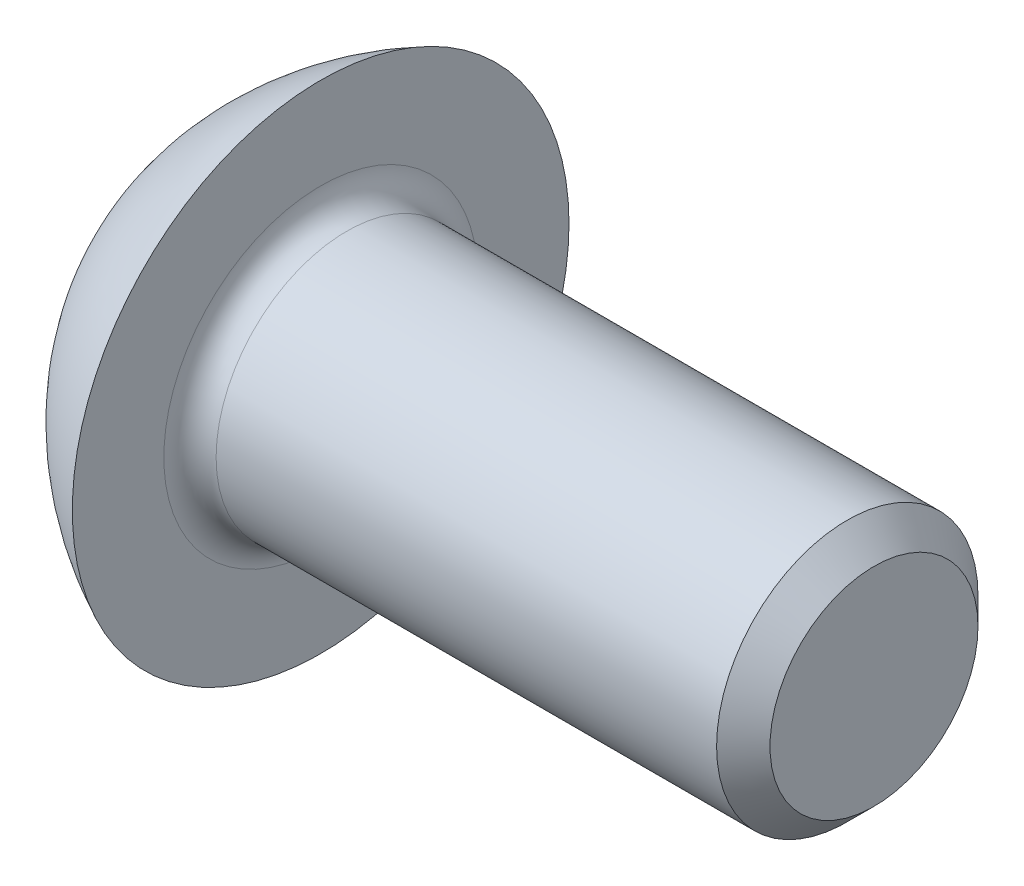
ISO-10303-21;
HEADER;
FILE_DESCRIPTION(('STEP AP214'),'2;1');
FILE_NAME('part.step','',(''),(''),'','','');
FILE_SCHEMA(('AUTOMOTIVE_DESIGN { 1 0 10303 214 1 1 1 1 }'));
ENDSEC;
DATA;
#1=APPLICATION_CONTEXT('core data for automotive mechanical design processes');
#2=APPLICATION_PROTOCOL_DEFINITION('international standard','automotive_design',2000,#1);
#3=PRODUCT_CONTEXT('',#1,'mechanical');
#4=PRODUCT('Part','Part','',(#3));
#5=PRODUCT_RELATED_PRODUCT_CATEGORY('part','',(#4));
#6=PRODUCT_DEFINITION_FORMATION('','',#4);
#7=PRODUCT_DEFINITION_CONTEXT('part definition',#1,'design');
#8=PRODUCT_DEFINITION('design','',#6,#7);
#9=PRODUCT_DEFINITION_SHAPE('','',#8);
#10=(LENGTH_UNIT() NAMED_UNIT(*) SI_UNIT(.MILLI.,.METRE.));
#11=(NAMED_UNIT(*) PLANE_ANGLE_UNIT() SI_UNIT($,.RADIAN.));
#12=(NAMED_UNIT(*) SI_UNIT($,.STERADIAN.) SOLID_ANGLE_UNIT());
#13=UNCERTAINTY_MEASURE_WITH_UNIT(LENGTH_MEASURE(1.E-05),#10,'distance_accuracy_value','');
#14=(GEOMETRIC_REPRESENTATION_CONTEXT(3) GLOBAL_UNCERTAINTY_ASSIGNED_CONTEXT((#13)) GLOBAL_UNIT_ASSIGNED_CONTEXT((#10,
#11,#12)) REPRESENTATION_CONTEXT('',''));
#15=CARTESIAN_POINT('',(0.,0.,0.));
#16=DIRECTION('',(0.,0.,1.));
#17=DIRECTION('',(1.,0.,0.));
#18=AXIS2_PLACEMENT_3D('',#15,#16,#17);
#19=CARTESIAN_POINT('',(0.,0.,0.));
#20=DIRECTION('',(1.,0.,0.));
#21=DIRECTION('',(0.,0.,-1.));
#22=AXIS2_PLACEMENT_3D('',#19,#20,#21);
#23=PLANE('',#22);
#24=CARTESIAN_POINT('',(0.,0.,0.));
#25=DIRECTION('',(1.,0.,0.));
#26=DIRECTION('',(0.,0.,-1.));
#27=AXIS2_PLACEMENT_3D('',#24,#25,#26);
#28=CIRCLE('',#27,1.30000000000001);
#29=CARTESIAN_POINT('',(0.,0.,-1.30000000000001));
#30=VERTEX_POINT('',#29);
#31=EDGE_CURVE('E97',#30,#30,#28,.T.);
#32=ORIENTED_EDGE('',*,*,#31,.F.);
#33=EDGE_LOOP('',(#32));
#34=FACE_BOUND('',#33,.T.);
#35=DIRECTION('',(0.,-1.,0.));
#36=VECTOR('',#35,1.);
#37=CARTESIAN_POINT('',(0.,0.57735026918963,1.));
#38=LINE('',#37,#36);
#39=CARTESIAN_POINT('',(0.,0.57735026918963,1.));
#40=VERTEX_POINT('',#39);
#41=CARTESIAN_POINT('',(0.,-0.57735026918963,1.));
#42=VERTEX_POINT('',#41);
#43=EDGE_CURVE('E82',#40,#42,#38,.T.);
#44=ORIENTED_EDGE('',*,*,#43,.T.);
#45=DIRECTION('',(0.,-0.500000000000029,-0.866025403784422));
#46=VECTOR('',#45,1.);
#47=CARTESIAN_POINT('',(0.,-0.57735026918963,1.));
#48=LINE('',#47,#46);
#49=CARTESIAN_POINT('',(0.,-1.1547005383793,0.));
#50=VERTEX_POINT('',#49);
#51=EDGE_CURVE('E70',#42,#50,#48,.T.);
#52=ORIENTED_EDGE('',*,*,#51,.T.);
#53=DIRECTION('',(0.,0.500000000000029,-0.866025403784422));
#54=VECTOR('',#53,1.);
#55=CARTESIAN_POINT('',(0.,-1.1547005383793,0.));
#56=LINE('',#55,#54);
#57=CARTESIAN_POINT('',(0.,-0.57735026918963,-1.));
#58=VERTEX_POINT('',#57);
#59=EDGE_CURVE('E81',#50,#58,#56,.T.);
#60=ORIENTED_EDGE('',*,*,#59,.T.);
#61=DIRECTION('',(0.,1.,0.));
#62=VECTOR('',#61,1.);
#63=CARTESIAN_POINT('',(0.,-0.57735026918963,-1.));
#64=LINE('',#63,#62);
#65=CARTESIAN_POINT('',(0.,0.57735026918963,-1.));
#66=VERTEX_POINT('',#65);
#67=EDGE_CURVE('E110',#58,#66,#64,.T.);
#68=ORIENTED_EDGE('',*,*,#67,.T.);
#69=DIRECTION('',(0.,0.500000000000029,0.866025403784422));
#70=VECTOR('',#69,1.);
#71=CARTESIAN_POINT('',(0.,0.57735026918963,-1.));
#72=LINE('',#71,#70);
#73=CARTESIAN_POINT('',(0.,1.1547005383793,0.));
#74=VERTEX_POINT('',#73);
#75=EDGE_CURVE('E116',#66,#74,#72,.T.);
#76=ORIENTED_EDGE('',*,*,#75,.T.);
#77=DIRECTION('',(0.,-0.500000000000029,0.866025403784422));
#78=VECTOR('',#77,1.);
#79=CARTESIAN_POINT('',(0.,1.1547005383793,0.));
#80=LINE('',#79,#78);
#81=EDGE_CURVE('E95',#74,#40,#80,.T.);
#82=ORIENTED_EDGE('',*,*,#81,.T.);
#83=EDGE_LOOP('',(#44,#52,#60,#68,#76,#82));
#84=FACE_BOUND('',#83,.T.);
#85=ADVANCED_FACE('F17',(#34,#84),#23,.F.);
#86=CARTESIAN_POINT('',(3.23684159472575,0.,0.));
#87=DIRECTION('',(1.,0.,0.));
#88=DIRECTION('',(0.,0.,-1.));
#89=AXIS2_PLACEMENT_3D('',#86,#87,#88);
#90=DEGENERATE_TOROIDAL_SURFACE('',#89,0.492444278256446,3.70000000000014,.F.);
#91=ORIENTED_EDGE('',*,*,#31,.T.);
#92=EDGE_LOOP('',(#91));
#93=FACE_BOUND('',#92,.T.);
#94=CARTESIAN_POINT('',(1.65,0.,0.));
#95=DIRECTION('',(1.,0.,0.));
#96=DIRECTION('',(0.,0.,-1.));
#97=AXIS2_PLACEMENT_3D('',#94,#95,#96);
#98=CIRCLE('',#97,2.85);
#99=CARTESIAN_POINT('',(1.65,0.,-2.85));
#100=VERTEX_POINT('',#99);
#101=EDGE_CURVE('E125',#100,#100,#98,.T.);
#102=ORIENTED_EDGE('',*,*,#101,.F.);
#103=EDGE_LOOP('',(#102));
#104=FACE_BOUND('',#103,.T.);
#105=ADVANCED_FACE('F220',(#93,#104),#90,.F.);
#106=CARTESIAN_POINT('',(0.99,0.57735026918963,1.));
#107=DIRECTION('',(0.,0.,-1.));
#108=DIRECTION('',(-1.,0.,0.));
#109=AXIS2_PLACEMENT_3D('',#106,#107,#108);
#110=PLANE('',#109);
#111=ORIENTED_EDGE('',*,*,#43,.F.);
#112=DIRECTION('',(-1.,0.,0.));
#113=VECTOR('',#112,1.);
#114=CARTESIAN_POINT('',(0.99,0.57735026918963,1.));
#115=LINE('',#114,#113);
#116=CARTESIAN_POINT('',(0.99,0.57735026918963,1.));
#117=VERTEX_POINT('',#116);
#118=EDGE_CURVE('E131',#117,#40,#115,.T.);
#119=ORIENTED_EDGE('',*,*,#118,.F.);
#120=DIRECTION('',(0.,-1.,0.));
#121=VECTOR('',#120,1.);
#122=CARTESIAN_POINT('',(0.99,0.57735026918963,1.));
#123=LINE('',#122,#121);
#124=CARTESIAN_POINT('',(0.99,-0.57735026918963,1.));
#125=VERTEX_POINT('',#124);
#126=EDGE_CURVE('E89',#117,#125,#123,.T.);
#127=ORIENTED_EDGE('',*,*,#126,.T.);
#128=DIRECTION('',(-1.,0.,0.));
#129=VECTOR('',#128,1.);
#130=CARTESIAN_POINT('',(0.99,-0.57735026918963,1.));
#131=LINE('',#130,#129);
#132=EDGE_CURVE('E74',#125,#42,#131,.T.);
#133=ORIENTED_EDGE('',*,*,#132,.T.);
#134=EDGE_LOOP('',(#111,#119,#127,#133));
#135=FACE_BOUND('',#134,.T.);
#136=ADVANCED_FACE('F87',(#135),#110,.T.);
#137=CARTESIAN_POINT('',(0.99,-0.57735026918963,1.));
#138=DIRECTION('',(0.,0.866025403784422,-0.500000000000029));
#139=DIRECTION('',(0.,0.500000000000029,0.866025403784422));
#140=AXIS2_PLACEMENT_3D('',#137,#138,#139);
#141=PLANE('',#140);
#142=ORIENTED_EDGE('',*,*,#51,.F.);
#143=ORIENTED_EDGE('',*,*,#132,.F.);
#144=DIRECTION('',(0.,-0.500000000000029,-0.866025403784422));
#145=VECTOR('',#144,1.);
#146=CARTESIAN_POINT('',(0.99,-0.57735026918963,1.));
#147=LINE('',#146,#145);
#148=CARTESIAN_POINT('',(0.99,-1.1547005383793,0.));
#149=VERTEX_POINT('',#148);
#150=EDGE_CURVE('E91',#125,#149,#147,.T.);
#151=ORIENTED_EDGE('',*,*,#150,.T.);
#152=DIRECTION('',(-1.,0.,0.));
#153=VECTOR('',#152,1.);
#154=CARTESIAN_POINT('',(0.99,-1.1547005383793,0.));
#155=LINE('',#154,#153);
#156=EDGE_CURVE('E76',#149,#50,#155,.T.);
#157=ORIENTED_EDGE('',*,*,#156,.T.);
#158=EDGE_LOOP('',(#142,#143,#151,#157));
#159=FACE_BOUND('',#158,.T.);
#160=ADVANCED_FACE('F72',(#159),#141,.T.);
#161=CARTESIAN_POINT('',(0.99,-1.1547005383793,0.));
#162=DIRECTION('',(0.,0.866025403784422,0.500000000000029));
#163=DIRECTION('',(0.,-0.500000000000029,0.866025403784422));
#164=AXIS2_PLACEMENT_3D('',#161,#162,#163);
#165=PLANE('',#164);
#166=ORIENTED_EDGE('',*,*,#59,.F.);
#167=ORIENTED_EDGE('',*,*,#156,.F.);
#168=DIRECTION('',(0.,0.500000000000029,-0.866025403784422));
#169=VECTOR('',#168,1.);
#170=CARTESIAN_POINT('',(0.99,-1.1547005383793,0.));
#171=LINE('',#170,#169);
#172=CARTESIAN_POINT('',(0.99,-0.57735026918963,-1.));
#173=VERTEX_POINT('',#172);
#174=EDGE_CURVE('E148',#149,#173,#171,.T.);
#175=ORIENTED_EDGE('',*,*,#174,.T.);
#176=DIRECTION('',(-1.,0.,0.));
#177=VECTOR('',#176,1.);
#178=CARTESIAN_POINT('',(0.99,-0.57735026918963,-1.));
#179=LINE('',#178,#177);
#180=EDGE_CURVE('E154',#173,#58,#179,.T.);
#181=ORIENTED_EDGE('',*,*,#180,.T.);
#182=EDGE_LOOP('',(#166,#167,#175,#181));
#183=FACE_BOUND('',#182,.T.);
#184=ADVANCED_FACE('F235',(#183),#165,.T.);
#185=CARTESIAN_POINT('',(0.99,-0.57735026918963,-1.));
#186=DIRECTION('',(0.,0.,1.));
#187=DIRECTION('',(1.,0.,0.));
#188=AXIS2_PLACEMENT_3D('',#185,#186,#187);
#189=PLANE('',#188);
#190=ORIENTED_EDGE('',*,*,#67,.F.);
#191=ORIENTED_EDGE('',*,*,#180,.F.);
#192=DIRECTION('',(0.,1.,0.));
#193=VECTOR('',#192,1.);
#194=CARTESIAN_POINT('',(0.99,-0.57735026918963,-1.));
#195=LINE('',#194,#193);
#196=CARTESIAN_POINT('',(0.99,0.57735026918963,-1.));
#197=VERTEX_POINT('',#196);
#198=EDGE_CURVE('E160',#173,#197,#195,.T.);
#199=ORIENTED_EDGE('',*,*,#198,.T.);
#200=DIRECTION('',(-1.,0.,0.));
#201=VECTOR('',#200,1.);
#202=CARTESIAN_POINT('',(0.99,0.57735026918963,-1.));
#203=LINE('',#202,#201);
#204=EDGE_CURVE('E165',#197,#66,#203,.T.);
#205=ORIENTED_EDGE('',*,*,#204,.T.);
#206=EDGE_LOOP('',(#190,#191,#199,#205));
#207=FACE_BOUND('',#206,.T.);
#208=ADVANCED_FACE('F238',(#207),#189,.T.);
#209=CARTESIAN_POINT('',(0.99,0.57735026918963,-1.));
#210=DIRECTION('',(0.,-0.866025403784422,0.500000000000029));
#211=DIRECTION('',(0.,-0.500000000000029,-0.866025403784422));
#212=AXIS2_PLACEMENT_3D('',#209,#210,#211);
#213=PLANE('',#212);
#214=ORIENTED_EDGE('',*,*,#75,.F.);
#215=ORIENTED_EDGE('',*,*,#204,.F.);
#216=DIRECTION('',(0.,0.500000000000029,0.866025403784422));
#217=VECTOR('',#216,1.);
#218=CARTESIAN_POINT('',(0.99,0.57735026918963,-1.));
#219=LINE('',#218,#217);
#220=CARTESIAN_POINT('',(0.99,1.1547005383793,0.));
#221=VERTEX_POINT('',#220);
#222=EDGE_CURVE('E37',#197,#221,#219,.T.);
#223=ORIENTED_EDGE('',*,*,#222,.T.);
#224=DIRECTION('',(-1.,0.,0.));
#225=VECTOR('',#224,1.);
#226=CARTESIAN_POINT('',(0.99,1.1547005383793,0.));
#227=LINE('',#226,#225);
#228=EDGE_CURVE('E175',#221,#74,#227,.T.);
#229=ORIENTED_EDGE('',*,*,#228,.T.);
#230=EDGE_LOOP('',(#214,#215,#223,#229));
#231=FACE_BOUND('',#230,.T.);
#232=ADVANCED_FACE('F242',(#231),#213,.T.);
#233=CARTESIAN_POINT('',(0.99,1.1547005383793,0.));
#234=DIRECTION('',(0.,-0.866025403784422,-0.500000000000029));
#235=DIRECTION('',(0.,0.500000000000029,-0.866025403784422));
#236=AXIS2_PLACEMENT_3D('',#233,#234,#235);
#237=PLANE('',#236);
#238=ORIENTED_EDGE('',*,*,#81,.F.);
#239=ORIENTED_EDGE('',*,*,#228,.F.);
#240=DIRECTION('',(0.,-0.500000000000029,0.866025403784422));
#241=VECTOR('',#240,1.);
#242=CARTESIAN_POINT('',(0.99,1.1547005383793,0.));
#243=LINE('',#242,#241);
#244=EDGE_CURVE('E33',#221,#117,#243,.T.);
#245=ORIENTED_EDGE('',*,*,#244,.T.);
#246=ORIENTED_EDGE('',*,*,#118,.T.);
#247=EDGE_LOOP('',(#238,#239,#245,#246));
#248=FACE_BOUND('',#247,.T.);
#249=ADVANCED_FACE('F216',(#248),#237,.T.);
#250=CARTESIAN_POINT('',(1.65,2.85,0.));
#251=DIRECTION('',(-1.,0.,0.));
#252=DIRECTION('',(0.,0.,1.));
#253=AXIS2_PLACEMENT_3D('',#250,#251,#252);
#254=PLANE('',#253);
#255=CARTESIAN_POINT('',(1.65,0.,0.));
#256=DIRECTION('',(1.,0.,0.));
#257=DIRECTION('',(0.,0.,-1.));
#258=AXIS2_PLACEMENT_3D('',#255,#256,#257);
#259=CIRCLE('',#258,1.79999999999988);
#260=CARTESIAN_POINT('',(1.65,0.,-1.79999999999988));
#261=VERTEX_POINT('',#260);
#262=EDGE_CURVE('E185',#261,#261,#259,.T.);
#263=ORIENTED_EDGE('',*,*,#262,.F.);
#264=EDGE_LOOP('',(#263));
#265=FACE_BOUND('',#264,.T.);
#266=ORIENTED_EDGE('',*,*,#101,.T.);
#267=EDGE_LOOP('',(#266));
#268=FACE_BOUND('',#267,.T.);
#269=ADVANCED_FACE('F213',(#265,#268),#254,.F.);
#270=CARTESIAN_POINT('',(0.99,0.,0.));
#271=DIRECTION('',(1.,0.,0.));
#272=DIRECTION('',(0.,0.,-1.));
#273=AXIS2_PLACEMENT_3D('',#270,#271,#272);
#274=PLANE('',#273);
#275=ORIENTED_EDGE('',*,*,#126,.F.);
#276=ORIENTED_EDGE('',*,*,#244,.F.);
#277=ORIENTED_EDGE('',*,*,#222,.F.);
#278=ORIENTED_EDGE('',*,*,#198,.F.);
#279=ORIENTED_EDGE('',*,*,#174,.F.);
#280=ORIENTED_EDGE('',*,*,#150,.F.);
#281=EDGE_LOOP('',(#275,#276,#277,#278,#279,#280));
#282=FACE_BOUND('',#281,.T.);
#283=ADVANCED_FACE('F209',(#282),#274,.F.);
#284=CARTESIAN_POINT('',(1.94999999999988,0.,0.));
#285=DIRECTION('',(1.,0.,0.));
#286=DIRECTION('',(0.,0.,-1.));
#287=AXIS2_PLACEMENT_3D('',#284,#285,#286);
#288=TOROIDAL_SURFACE('',#287,1.79999999999988,0.299999999999878);
#289=CARTESIAN_POINT('',(1.95,0.,0.));
#290=DIRECTION('',(1.,0.,0.));
#291=DIRECTION('',(0.,0.,-1.));
#292=AXIS2_PLACEMENT_3D('',#289,#290,#291);
#293=CIRCLE('',#292,1.5);
#294=CARTESIAN_POINT('',(1.95,0.,-1.5));
#295=VERTEX_POINT('',#294);
#296=EDGE_CURVE('E191',#295,#295,#293,.T.);
#297=ORIENTED_EDGE('',*,*,#296,.F.);
#298=EDGE_LOOP('',(#297));
#299=FACE_BOUND('',#298,.T.);
#300=ORIENTED_EDGE('',*,*,#262,.T.);
#301=EDGE_LOOP('',(#300));
#302=FACE_BOUND('',#301,.T.);
#303=ADVANCED_FACE('F203',(#299,#302),#288,.F.);
#304=CARTESIAN_POINT('',(8.,0.,0.));
#305=DIRECTION('',(1.,0.,0.));
#306=DIRECTION('',(0.,0.,-1.));
#307=AXIS2_PLACEMENT_3D('',#304,#305,#306);
#308=CYLINDRICAL_SURFACE('',#307,1.5);
#309=CARTESIAN_POINT('',(7.6935,0.,0.));
#310=DIRECTION('',(1.,0.,0.));
#311=DIRECTION('',(0.,0.,-1.));
#312=AXIS2_PLACEMENT_3D('',#309,#310,#311);
#313=CIRCLE('',#312,1.5);
#314=CARTESIAN_POINT('',(7.6935,0.,-1.5));
#315=VERTEX_POINT('',#314);
#316=EDGE_CURVE('E26',#315,#315,#313,.T.);
#317=ORIENTED_EDGE('',*,*,#316,.F.);
#318=EDGE_LOOP('',(#317));
#319=FACE_BOUND('',#318,.T.);
#320=ORIENTED_EDGE('',*,*,#296,.T.);
#321=EDGE_LOOP('',(#320));
#322=FACE_BOUND('',#321,.T.);
#323=ADVANCED_FACE('F200',(#319,#322),#308,.T.);
#324=CARTESIAN_POINT('',(7.6935,0.,0.));
#325=DIRECTION('',(-1.,0.,0.));
#326=DIRECTION('',(0.,0.,1.));
#327=AXIS2_PLACEMENT_3D('',#324,#325,#326);
#328=CONICAL_SURFACE('',#327,1.5,0.785398163397449);
#329=CARTESIAN_POINT('',(8.,0.,0.));
#330=DIRECTION('',(1.,0.,0.));
#331=DIRECTION('',(0.,0.,-1.));
#332=AXIS2_PLACEMENT_3D('',#329,#330,#331);
#333=CIRCLE('',#332,1.1935);
#334=CARTESIAN_POINT('',(8.,0.,-1.1935));
#335=VERTEX_POINT('',#334);
#336=EDGE_CURVE('E11',#335,#335,#333,.T.);
#337=ORIENTED_EDGE('',*,*,#336,.F.);
#338=EDGE_LOOP('',(#337));
#339=FACE_BOUND('',#338,.T.);
#340=ORIENTED_EDGE('',*,*,#316,.T.);
#341=EDGE_LOOP('',(#340));
#342=FACE_BOUND('',#341,.T.);
#343=ADVANCED_FACE('F198',(#339,#342),#328,.T.);
#344=CARTESIAN_POINT('',(8.,1.1935,0.));
#345=DIRECTION('',(-1.,0.,0.));
#346=DIRECTION('',(0.,0.,1.));
#347=AXIS2_PLACEMENT_3D('',#344,#345,#346);
#348=PLANE('',#347);
#349=ORIENTED_EDGE('',*,*,#336,.T.);
#350=EDGE_LOOP('',(#349));
#351=FACE_BOUND('',#350,.T.);
#352=ADVANCED_FACE('F19',(#351),#348,.F.);
#353=CLOSED_SHELL('',(#85,#105,#136,#160,#184,#208,#232,#249,#269,#283,#303,#323,#343,#352));
#354=MANIFOLD_SOLID_BREP('B1',#353);
#355=ADVANCED_BREP_SHAPE_REPRESENTATION('',(#18,#354),#14);
#356=SHAPE_DEFINITION_REPRESENTATION(#9,#355);
ENDSEC;
END-ISO-10303-21;
